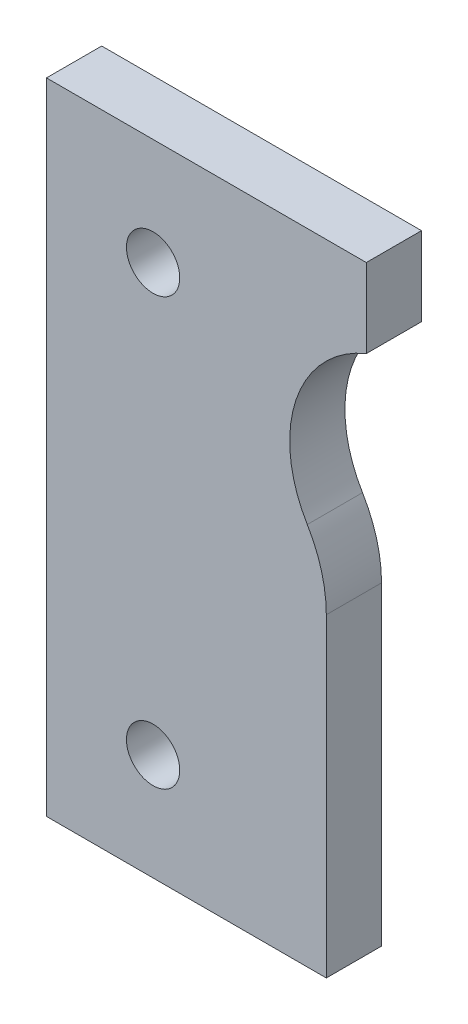
ISO-10303-21;
HEADER;
FILE_DESCRIPTION(('STEP AP214'),'2;1');
FILE_NAME('part.step','',(''),(''),'','','');
FILE_SCHEMA(('AUTOMOTIVE_DESIGN { 1 0 10303 214 1 1 1 1 }'));
ENDSEC;
DATA;
#1=APPLICATION_CONTEXT('core data for automotive mechanical design processes');
#2=APPLICATION_PROTOCOL_DEFINITION('international standard','automotive_design',2000,#1);
#3=PRODUCT_CONTEXT('',#1,'mechanical');
#4=PRODUCT('Part','Part','',(#3));
#5=PRODUCT_RELATED_PRODUCT_CATEGORY('part','',(#4));
#6=PRODUCT_DEFINITION_FORMATION('','',#4);
#7=PRODUCT_DEFINITION_CONTEXT('part definition',#1,'design');
#8=PRODUCT_DEFINITION('design','',#6,#7);
#9=PRODUCT_DEFINITION_SHAPE('','',#8);
#10=(LENGTH_UNIT() NAMED_UNIT(*) SI_UNIT(.MILLI.,.METRE.));
#11=(NAMED_UNIT(*) PLANE_ANGLE_UNIT() SI_UNIT($,.RADIAN.));
#12=(NAMED_UNIT(*) SI_UNIT($,.STERADIAN.) SOLID_ANGLE_UNIT());
#13=UNCERTAINTY_MEASURE_WITH_UNIT(LENGTH_MEASURE(1.E-05),#10,'distance_accuracy_value','');
#14=(GEOMETRIC_REPRESENTATION_CONTEXT(3) GLOBAL_UNCERTAINTY_ASSIGNED_CONTEXT((#13)) GLOBAL_UNIT_ASSIGNED_CONTEXT((#10,
#11,#12)) REPRESENTATION_CONTEXT('',''));
#15=CARTESIAN_POINT('',(0.,0.,0.));
#16=DIRECTION('',(0.,0.,1.));
#17=DIRECTION('',(1.,0.,0.));
#18=AXIS2_PLACEMENT_3D('',#15,#16,#17);
#19=CARTESIAN_POINT('',(-32.5437499999938,-15.7343197939269,6.5786));
#20=DIRECTION('',(0.,0.,-1.));
#21=DIRECTION('',(-1.,0.,0.));
#22=AXIS2_PLACEMENT_3D('',#19,#20,#21);
#23=CYLINDRICAL_SURFACE('',#22,15.8749999999984);
#24=CARTESIAN_POINT('',(-32.5437499999938,-15.7343197939269,0.));
#25=DIRECTION('',(0.,0.,1.));
#26=DIRECTION('',(1.,0.,0.));
#27=AXIS2_PLACEMENT_3D('',#24,#25,#26);
#28=CIRCLE('',#27,15.8749999999984);
#29=CARTESIAN_POINT('',(-16.6687499999954,-15.7343197939269,0.));
#30=VERTEX_POINT('',#29);
#31=CARTESIAN_POINT('',(-18.9351932668292,-7.55979787272621,0.));
#32=VERTEX_POINT('',#31);
#33=EDGE_CURVE('E136',#30,#32,#28,.T.);
#34=ORIENTED_EDGE('',*,*,#33,.T.);
#35=DIRECTION('',(0.,0.,-1.));
#36=VECTOR('',#35,1.);
#37=CARTESIAN_POINT('',(-18.9351932668292,-7.55979787272621,6.5786));
#38=LINE('',#37,#36);
#39=CARTESIAN_POINT('',(-18.9351932668292,-7.55979787272621,6.5786));
#40=VERTEX_POINT('',#39);
#41=EDGE_CURVE('E53',#40,#32,#38,.T.);
#42=ORIENTED_EDGE('',*,*,#41,.F.);
#43=CARTESIAN_POINT('',(-32.5437499999938,-15.7343197939269,6.5786));
#44=DIRECTION('',(0.,0.,1.));
#45=DIRECTION('',(1.,0.,0.));
#46=AXIS2_PLACEMENT_3D('',#43,#44,#45);
#47=CIRCLE('',#46,15.8749999999984);
#48=CARTESIAN_POINT('',(-16.6687499999954,-15.7343197939269,6.5786));
#49=VERTEX_POINT('',#48);
#50=EDGE_CURVE('E171',#49,#40,#47,.T.);
#51=ORIENTED_EDGE('',*,*,#50,.F.);
#52=DIRECTION('',(0.,0.,-1.));
#53=VECTOR('',#52,1.);
#54=CARTESIAN_POINT('',(-16.6687499999954,-15.7343197939269,6.5786));
#55=LINE('',#54,#53);
#56=EDGE_CURVE('E12',#49,#30,#55,.T.);
#57=ORIENTED_EDGE('',*,*,#56,.T.);
#58=EDGE_LOOP('',(#34,#42,#51,#57));
#59=FACE_BOUND('',#58,.T.);
#60=ADVANCED_FACE('F45',(#59),#23,.T.);
#61=CARTESIAN_POINT('',(-6.34999999999728,1.04182113962121E-12,6.5786));
#62=DIRECTION('',(0.,0.,-1.));
#63=DIRECTION('',(-1.,0.,0.));
#64=AXIS2_PLACEMENT_3D('',#61,#62,#63);
#65=CYLINDRICAL_SURFACE('',#64,14.6812000000001);
#66=CARTESIAN_POINT('',(-6.34999999999728,1.04182113962121E-12,0.));
#67=DIRECTION('',(0.,0.,-1.));
#68=DIRECTION('',(1.,0.,0.));
#69=AXIS2_PLACEMENT_3D('',#66,#67,#68);
#70=CIRCLE('',#69,14.6812000000001);
#71=CARTESIAN_POINT('',(-11.9062499999984,13.5891765525921,0.));
#72=VERTEX_POINT('',#71);
#73=EDGE_CURVE('E138',#32,#72,#70,.T.);
#74=ORIENTED_EDGE('',*,*,#73,.T.);
#75=DIRECTION('',(0.,0.,-1.));
#76=VECTOR('',#75,1.);
#77=CARTESIAN_POINT('',(-11.9062499999984,13.5891765525921,6.5786));
#78=LINE('',#77,#76);
#79=CARTESIAN_POINT('',(-11.9062499999984,13.5891765525921,6.5786));
#80=VERTEX_POINT('',#79);
#81=EDGE_CURVE('E151',#80,#72,#78,.T.);
#82=ORIENTED_EDGE('',*,*,#81,.F.);
#83=CARTESIAN_POINT('',(-6.34999999999728,1.04182113962121E-12,6.5786));
#84=DIRECTION('',(0.,0.,-1.));
#85=DIRECTION('',(1.,0.,0.));
#86=AXIS2_PLACEMENT_3D('',#83,#84,#85);
#87=CIRCLE('',#86,14.6812000000001);
#88=EDGE_CURVE('E160',#40,#80,#87,.T.);
#89=ORIENTED_EDGE('',*,*,#88,.F.);
#90=ORIENTED_EDGE('',*,*,#41,.T.);
#91=EDGE_LOOP('',(#74,#82,#89,#90));
#92=FACE_BOUND('',#91,.T.);
#93=ADVANCED_FACE('F158',(#92),#65,.F.);
#94=CARTESIAN_POINT('',(-11.9062499999984,22.9871765525921,6.5786));
#95=DIRECTION('',(-1.,0.,0.));
#96=DIRECTION('',(0.,-1.,0.));
#97=AXIS2_PLACEMENT_3D('',#94,#95,#96);
#98=PLANE('',#97);
#99=DIRECTION('',(0.,1.,0.));
#100=VECTOR('',#99,1.);
#101=CARTESIAN_POINT('',(-11.9062499999984,22.9871765525921,0.));
#102=LINE('',#101,#100);
#103=CARTESIAN_POINT('',(-11.9062499999984,22.9871765525921,0.));
#104=VERTEX_POINT('',#103);
#105=EDGE_CURVE('E141',#72,#104,#102,.T.);
#106=ORIENTED_EDGE('',*,*,#105,.T.);
#107=DIRECTION('',(0.,0.,-1.));
#108=VECTOR('',#107,1.);
#109=CARTESIAN_POINT('',(-11.9062499999984,22.9871765525921,6.5786));
#110=LINE('',#109,#108);
#111=CARTESIAN_POINT('',(-11.9062499999984,22.9871765525921,6.5786));
#112=VERTEX_POINT('',#111);
#113=EDGE_CURVE('E125',#112,#104,#110,.T.);
#114=ORIENTED_EDGE('',*,*,#113,.F.);
#115=DIRECTION('',(0.,1.,0.));
#116=VECTOR('',#115,1.);
#117=CARTESIAN_POINT('',(-11.9062499999984,22.9871765525921,6.5786));
#118=LINE('',#117,#116);
#119=EDGE_CURVE('E116',#80,#112,#118,.T.);
#120=ORIENTED_EDGE('',*,*,#119,.F.);
#121=ORIENTED_EDGE('',*,*,#81,.T.);
#122=EDGE_LOOP('',(#106,#114,#120,#121));
#123=FACE_BOUND('',#122,.T.);
#124=ADVANCED_FACE('F169',(#123),#98,.F.);
#125=CARTESIAN_POINT('',(-11.9062499999984,22.9871765525921,6.5786));
#126=DIRECTION('',(0.,-1.,0.));
#127=DIRECTION('',(1.,0.,0.));
#128=AXIS2_PLACEMENT_3D('',#125,#126,#127);
#129=PLANE('',#128);
#130=DIRECTION('',(-1.,0.,0.));
#131=VECTOR('',#130,1.);
#132=CARTESIAN_POINT('',(-11.9062499999984,22.9871765525921,0.));
#133=LINE('',#132,#131);
#134=CARTESIAN_POINT('',(-50.0062499999984,22.9871765525921,0.));
#135=VERTEX_POINT('',#134);
#136=EDGE_CURVE('E124',#104,#135,#133,.T.);
#137=ORIENTED_EDGE('',*,*,#136,.T.);
#138=DIRECTION('',(0.,0.,-1.));
#139=VECTOR('',#138,1.);
#140=CARTESIAN_POINT('',(-50.0062499999984,22.9871765525921,6.5786));
#141=LINE('',#140,#139);
#142=CARTESIAN_POINT('',(-50.0062499999984,22.9871765525921,6.5786));
#143=VERTEX_POINT('',#142);
#144=EDGE_CURVE('E121',#143,#135,#141,.T.);
#145=ORIENTED_EDGE('',*,*,#144,.F.);
#146=DIRECTION('',(-1.,0.,0.));
#147=VECTOR('',#146,1.);
#148=CARTESIAN_POINT('',(-11.9062499999984,22.9871765525921,6.5786));
#149=LINE('',#148,#147);
#150=EDGE_CURVE('E110',#112,#143,#149,.T.);
#151=ORIENTED_EDGE('',*,*,#150,.F.);
#152=ORIENTED_EDGE('',*,*,#113,.T.);
#153=EDGE_LOOP('',(#137,#145,#151,#152));
#154=FACE_BOUND('',#153,.T.);
#155=ADVANCED_FACE('F122',(#154),#129,.F.);
#156=CARTESIAN_POINT('',(-50.0062499999984,22.9871765525921,6.5786));
#157=DIRECTION('',(1.,0.,0.));
#158=DIRECTION('',(0.,0.,-1.));
#159=AXIS2_PLACEMENT_3D('',#156,#157,#158);
#160=PLANE('',#159);
#161=DIRECTION('',(0.,-1.,0.));
#162=VECTOR('',#161,1.);
#163=CARTESIAN_POINT('',(-50.0062499999984,22.9871765525921,0.));
#164=LINE('',#163,#162);
#165=CARTESIAN_POINT('',(-50.0062499999984,-53.2128234474079,0.));
#166=VERTEX_POINT('',#165);
#167=EDGE_CURVE('E89',#135,#166,#164,.T.);
#168=ORIENTED_EDGE('',*,*,#167,.T.);
#169=DIRECTION('',(0.,0.,-1.));
#170=VECTOR('',#169,1.);
#171=CARTESIAN_POINT('',(-50.0062499999984,-53.2128234474079,6.5786));
#172=LINE('',#171,#170);
#173=CARTESIAN_POINT('',(-50.0062499999984,-53.2128234474079,6.5786));
#174=VERTEX_POINT('',#173);
#175=EDGE_CURVE('E126',#174,#166,#172,.T.);
#176=ORIENTED_EDGE('',*,*,#175,.F.);
#177=DIRECTION('',(0.,-1.,0.));
#178=VECTOR('',#177,1.);
#179=CARTESIAN_POINT('',(-50.0062499999984,22.9871765525921,6.5786));
#180=LINE('',#179,#178);
#181=EDGE_CURVE('E114',#143,#174,#180,.T.);
#182=ORIENTED_EDGE('',*,*,#181,.F.);
#183=ORIENTED_EDGE('',*,*,#144,.T.);
#184=EDGE_LOOP('',(#168,#176,#182,#183));
#185=FACE_BOUND('',#184,.T.);
#186=ADVANCED_FACE('F128',(#185),#160,.F.);
#187=CARTESIAN_POINT('',(-50.0062499999984,-53.2128234474079,6.5786));
#188=DIRECTION('',(0.,1.,0.));
#189=DIRECTION('',(-1.,0.,0.));
#190=AXIS2_PLACEMENT_3D('',#187,#188,#189);
#191=PLANE('',#190);
#192=DIRECTION('',(1.,0.,0.));
#193=VECTOR('',#192,1.);
#194=CARTESIAN_POINT('',(-50.0062499999984,-53.2128234474079,0.));
#195=LINE('',#194,#193);
#196=CARTESIAN_POINT('',(-16.6687499999954,-53.2128234474079,0.));
#197=VERTEX_POINT('',#196);
#198=EDGE_CURVE('E96',#166,#197,#195,.T.);
#199=ORIENTED_EDGE('',*,*,#198,.T.);
#200=DIRECTION('',(0.,0.,-1.));
#201=VECTOR('',#200,1.);
#202=CARTESIAN_POINT('',(-16.6687499999954,-53.2128234474079,6.5786));
#203=LINE('',#202,#201);
#204=CARTESIAN_POINT('',(-16.6687499999954,-53.2128234474079,6.5786));
#205=VERTEX_POINT('',#204);
#206=EDGE_CURVE('E132',#205,#197,#203,.T.);
#207=ORIENTED_EDGE('',*,*,#206,.F.);
#208=DIRECTION('',(1.,0.,0.));
#209=VECTOR('',#208,1.);
#210=CARTESIAN_POINT('',(-50.0062499999984,-53.2128234474079,6.5786));
#211=LINE('',#210,#209);
#212=EDGE_CURVE('E130',#174,#205,#211,.T.);
#213=ORIENTED_EDGE('',*,*,#212,.F.);
#214=ORIENTED_EDGE('',*,*,#175,.T.);
#215=EDGE_LOOP('',(#199,#207,#213,#214));
#216=FACE_BOUND('',#215,.T.);
#217=ADVANCED_FACE('F219',(#216),#191,.F.);
#218=CARTESIAN_POINT('',(-16.6687499999954,-53.2128234474079,6.5786));
#219=DIRECTION('',(-1.,0.,0.));
#220=DIRECTION('',(0.,-1.,0.));
#221=AXIS2_PLACEMENT_3D('',#218,#219,#220);
#222=PLANE('',#221);
#223=DIRECTION('',(0.,1.,0.));
#224=VECTOR('',#223,1.);
#225=CARTESIAN_POINT('',(-16.6687499999954,-53.2128234474079,0.));
#226=LINE('',#225,#224);
#227=EDGE_CURVE('E146',#197,#30,#226,.T.);
#228=ORIENTED_EDGE('',*,*,#227,.T.);
#229=ORIENTED_EDGE('',*,*,#56,.F.);
#230=DIRECTION('',(0.,1.,0.));
#231=VECTOR('',#230,1.);
#232=CARTESIAN_POINT('',(-16.6687499999954,-39.6173299428413,6.5786));
#233=LINE('',#232,#231);
#234=EDGE_CURVE('E61',#205,#49,#233,.T.);
#235=ORIENTED_EDGE('',*,*,#234,.F.);
#236=ORIENTED_EDGE('',*,*,#206,.T.);
#237=EDGE_LOOP('',(#228,#229,#235,#236));
#238=FACE_BOUND('',#237,.T.);
#239=ADVANCED_FACE('F198',(#238),#222,.F.);
#240=CARTESIAN_POINT('',(-6.34999999999728,1.04182113962121E-12,6.5786));
#241=DIRECTION('',(0.,0.,1.));
#242=DIRECTION('',(1.,0.,0.));
#243=AXIS2_PLACEMENT_3D('',#240,#241,#242);
#244=PLANE('',#243);
#245=CARTESIAN_POINT('',(-37.3062499999984,10.2871765525921,6.5786));
#246=DIRECTION('',(0.,0.,1.));
#247=DIRECTION('',(1.,0.,0.));
#248=AXIS2_PLACEMENT_3D('',#245,#246,#247);
#249=CIRCLE('',#248,3.17499999999998);
#250=CARTESIAN_POINT('',(-34.1312499999984,10.2871765525921,6.5786));
#251=VERTEX_POINT('',#250);
#252=EDGE_CURVE('E190',#251,#251,#249,.T.);
#253=ORIENTED_EDGE('',*,*,#252,.F.);
#254=EDGE_LOOP('',(#253));
#255=FACE_BOUND('',#254,.T.);
#256=CARTESIAN_POINT('',(-37.3062499999984,-40.5128234474079,6.5786));
#257=DIRECTION('',(0.,0.,1.));
#258=DIRECTION('',(1.,0.,0.));
#259=AXIS2_PLACEMENT_3D('',#256,#257,#258);
#260=CIRCLE('',#259,3.17499999999998);
#261=CARTESIAN_POINT('',(-34.1312499999984,-40.5128234474079,6.5786));
#262=VERTEX_POINT('',#261);
#263=EDGE_CURVE('E184',#262,#262,#260,.T.);
#264=ORIENTED_EDGE('',*,*,#263,.F.);
#265=EDGE_LOOP('',(#264));
#266=FACE_BOUND('',#265,.T.);
#267=ORIENTED_EDGE('',*,*,#234,.T.);
#268=ORIENTED_EDGE('',*,*,#50,.T.);
#269=ORIENTED_EDGE('',*,*,#88,.T.);
#270=ORIENTED_EDGE('',*,*,#119,.T.);
#271=ORIENTED_EDGE('',*,*,#150,.T.);
#272=ORIENTED_EDGE('',*,*,#181,.T.);
#273=ORIENTED_EDGE('',*,*,#212,.T.);
#274=EDGE_LOOP('',(#267,#268,#269,#270,#271,#272,#273));
#275=FACE_BOUND('',#274,.T.);
#276=ADVANCED_FACE('F112',(#255,#266,#275),#244,.T.);
#277=CARTESIAN_POINT('',(-6.34999999999728,1.04182113962121E-12,0.));
#278=DIRECTION('',(0.,0.,1.));
#279=DIRECTION('',(1.,0.,0.));
#280=AXIS2_PLACEMENT_3D('',#277,#278,#279);
#281=PLANE('',#280);
#282=CARTESIAN_POINT('',(-37.3062499999984,10.2871765525921,0.));
#283=DIRECTION('',(0.,0.,1.));
#284=DIRECTION('',(1.,0.,0.));
#285=AXIS2_PLACEMENT_3D('',#282,#283,#284);
#286=CIRCLE('',#285,3.175);
#287=CARTESIAN_POINT('',(-34.1312499999984,10.2871765525921,0.));
#288=VERTEX_POINT('',#287);
#289=EDGE_CURVE('E187',#288,#288,#286,.T.);
#290=ORIENTED_EDGE('',*,*,#289,.T.);
#291=EDGE_LOOP('',(#290));
#292=FACE_BOUND('',#291,.T.);
#293=CARTESIAN_POINT('',(-37.3062499999984,-40.5128234474079,0.));
#294=DIRECTION('',(0.,0.,1.));
#295=DIRECTION('',(1.,0.,0.));
#296=AXIS2_PLACEMENT_3D('',#293,#294,#295);
#297=CIRCLE('',#296,3.175);
#298=CARTESIAN_POINT('',(-34.1312499999984,-40.5128234474079,0.));
#299=VERTEX_POINT('',#298);
#300=EDGE_CURVE('E139',#299,#299,#297,.T.);
#301=ORIENTED_EDGE('',*,*,#300,.T.);
#302=EDGE_LOOP('',(#301));
#303=FACE_BOUND('',#302,.T.);
#304=ORIENTED_EDGE('',*,*,#33,.F.);
#305=ORIENTED_EDGE('',*,*,#227,.F.);
#306=ORIENTED_EDGE('',*,*,#198,.F.);
#307=ORIENTED_EDGE('',*,*,#167,.F.);
#308=ORIENTED_EDGE('',*,*,#136,.F.);
#309=ORIENTED_EDGE('',*,*,#105,.F.);
#310=ORIENTED_EDGE('',*,*,#73,.F.);
#311=EDGE_LOOP('',(#304,#305,#306,#307,#308,#309,#310));
#312=FACE_BOUND('',#311,.T.);
#313=ADVANCED_FACE('F166',(#292,#303,#312),#281,.F.);
#314=CARTESIAN_POINT('',(-37.3062499999984,-40.5128234474079,6.5786));
#315=DIRECTION('',(0.,0.,1.));
#316=DIRECTION('',(1.,0.,0.));
#317=AXIS2_PLACEMENT_3D('',#314,#315,#316);
#318=CYLINDRICAL_SURFACE('',#317,3.17499999999999);
#319=ORIENTED_EDGE('',*,*,#300,.F.);
#320=EDGE_LOOP('',(#319));
#321=FACE_BOUND('',#320,.T.);
#322=ORIENTED_EDGE('',*,*,#263,.T.);
#323=EDGE_LOOP('',(#322));
#324=FACE_BOUND('',#323,.T.);
#325=ADVANCED_FACE('F202',(#321,#324),#318,.F.);
#326=CARTESIAN_POINT('',(-37.3062499999984,10.2871765525921,6.5786));
#327=DIRECTION('',(0.,0.,1.));
#328=DIRECTION('',(1.,0.,0.));
#329=AXIS2_PLACEMENT_3D('',#326,#327,#328);
#330=CYLINDRICAL_SURFACE('',#329,3.17499999999999);
#331=ORIENTED_EDGE('',*,*,#289,.F.);
#332=EDGE_LOOP('',(#331));
#333=FACE_BOUND('',#332,.T.);
#334=ORIENTED_EDGE('',*,*,#252,.T.);
#335=EDGE_LOOP('',(#334));
#336=FACE_BOUND('',#335,.T.);
#337=ADVANCED_FACE('F194',(#333,#336),#330,.F.);
#338=CLOSED_SHELL('',(#60,#93,#124,#155,#186,#217,#239,#276,#313,#325,#337));
#339=MANIFOLD_SOLID_BREP('B2',#338);
#340=ADVANCED_BREP_SHAPE_REPRESENTATION('',(#18,#339),#14);
#341=SHAPE_DEFINITION_REPRESENTATION(#9,#340);
ENDSEC;
END-ISO-10303-21;
